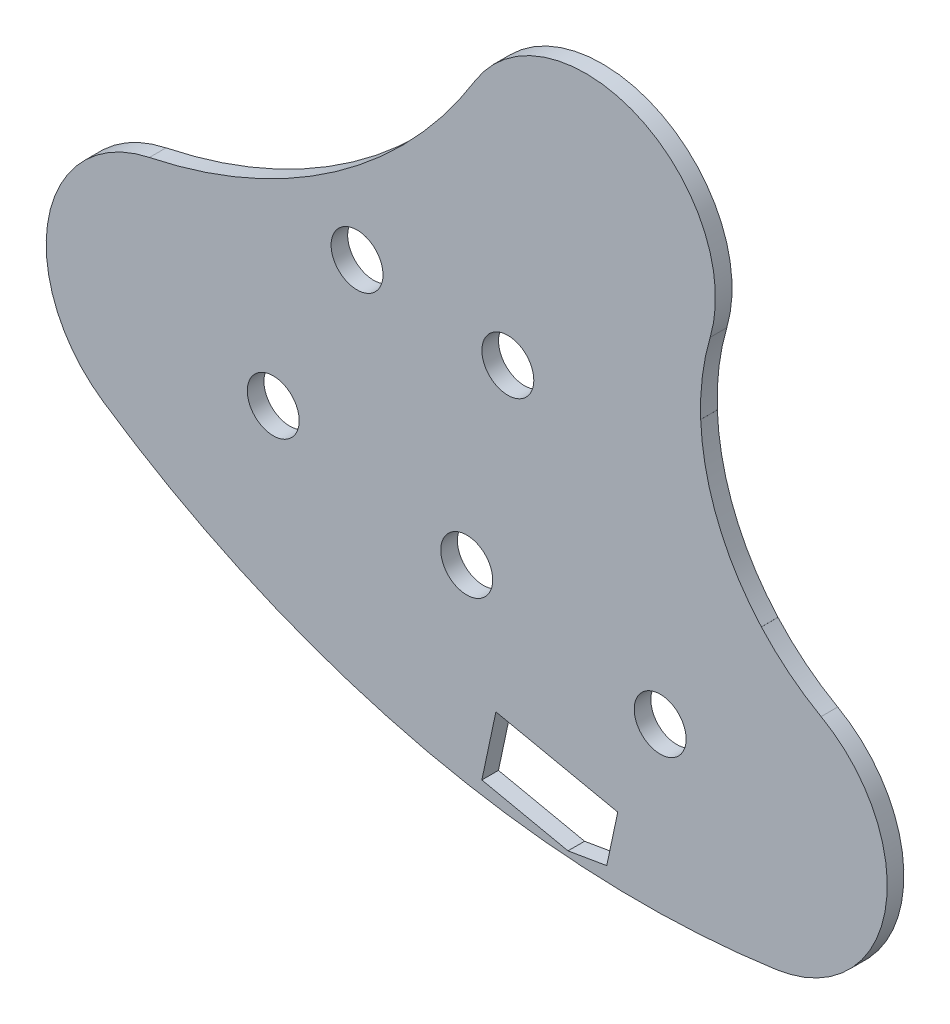
ISO-10303-21;
HEADER;
FILE_DESCRIPTION(('STEP AP214'),'2;1');
FILE_NAME('part.step','',(''),(''),'','','');
FILE_SCHEMA(('AUTOMOTIVE_DESIGN { 1 0 10303 214 1 1 1 1 }'));
ENDSEC;
DATA;
#1=APPLICATION_CONTEXT('core data for automotive mechanical design processes');
#2=APPLICATION_PROTOCOL_DEFINITION('international standard','automotive_design',2000,#1);
#3=PRODUCT_CONTEXT('',#1,'mechanical');
#4=PRODUCT('Part','Part','',(#3));
#5=PRODUCT_RELATED_PRODUCT_CATEGORY('part','',(#4));
#6=PRODUCT_DEFINITION_FORMATION('','',#4);
#7=PRODUCT_DEFINITION_CONTEXT('part definition',#1,'design');
#8=PRODUCT_DEFINITION('design','',#6,#7);
#9=PRODUCT_DEFINITION_SHAPE('','',#8);
#10=(LENGTH_UNIT() NAMED_UNIT(*) SI_UNIT(.MILLI.,.METRE.));
#11=(NAMED_UNIT(*) PLANE_ANGLE_UNIT() SI_UNIT($,.RADIAN.));
#12=(NAMED_UNIT(*) SI_UNIT($,.STERADIAN.) SOLID_ANGLE_UNIT());
#13=UNCERTAINTY_MEASURE_WITH_UNIT(LENGTH_MEASURE(1.E-05),#10,'distance_accuracy_value','');
#14=(GEOMETRIC_REPRESENTATION_CONTEXT(3) GLOBAL_UNCERTAINTY_ASSIGNED_CONTEXT((#13)) GLOBAL_UNIT_ASSIGNED_CONTEXT((#10,
#11,#12)) REPRESENTATION_CONTEXT('',''));
#15=CARTESIAN_POINT('',(0.,0.,0.));
#16=DIRECTION('',(0.,0.,1.));
#17=DIRECTION('',(1.,0.,0.));
#18=AXIS2_PLACEMENT_3D('',#15,#16,#17);
#19=CARTESIAN_POINT('',(0.,0.,0.));
#20=DIRECTION('',(0.,0.,1.));
#21=DIRECTION('',(1.,0.,0.));
#22=AXIS2_PLACEMENT_3D('',#19,#20,#21);
#23=PLANE('',#22);
#24=CARTESIAN_POINT('',(52.9965563220559,89.470524089229,0.));
#25=DIRECTION('',(0.,0.,1.));
#26=DIRECTION('',(1.,0.,0.));
#27=AXIS2_PLACEMENT_3D('',#24,#25,#26);
#28=CIRCLE('',#27,12.5);
#29=CARTESIAN_POINT('',(50.4360820238531,101.705472857746,0.));
#30=VERTEX_POINT('',#29);
#31=CARTESIAN_POINT('',(45.9842444447804,79.1226990938099,0.));
#32=VERTEX_POINT('',#31);
#33=EDGE_CURVE('E526',#30,#32,#28,.T.);
#34=ORIENTED_EDGE('',*,*,#33,.F.);
#35=CARTESIAN_POINT('',(40.5106952967139,149.132856994939,0.));
#36=DIRECTION('',(0.,0.,1.));
#37=DIRECTION('',(1.,0.,0.));
#38=AXIS2_PLACEMENT_3D('',#35,#36,#37);
#39=CIRCLE('',#38,48.4548250206325);
#40=CARTESIAN_POINT('',(81.8031102070491,123.77922730109,0.));
#41=VERTEX_POINT('',#40);
#42=EDGE_CURVE('E508',#30,#41,#39,.T.);
#43=ORIENTED_EDGE('',*,*,#42,.T.);
#44=CARTESIAN_POINT('',(92.4554071900515,117.238694525702,0.));
#45=DIRECTION('',(0.,0.,1.));
#46=DIRECTION('',(1.,0.,0.));
#47=AXIS2_PLACEMENT_3D('',#44,#45,#46);
#48=CIRCLE('',#47,12.5);
#49=CARTESIAN_POINT('',(104.446158592985,113.70713951508,0.));
#50=VERTEX_POINT('',#49);
#51=EDGE_CURVE('E693',#50,#41,#48,.T.);
#52=ORIENTED_EDGE('',*,*,#51,.F.);
#53=CARTESIAN_POINT('',(126.300081547321,107.270651215251,0.));
#54=DIRECTION('',(0.,0.,1.));
#55=DIRECTION('',(1.,0.,0.));
#56=AXIS2_PLACEMENT_3D('',#53,#54,#55);
#57=CIRCLE('',#56,22.7820615864298);
#58=CARTESIAN_POINT('',(103.534701401386,106.398987897814,0.));
#59=VERTEX_POINT('',#58);
#60=EDGE_CURVE('E573',#50,#59,#57,.T.);
#61=ORIENTED_EDGE('',*,*,#60,.T.);
#62=CARTESIAN_POINT('',(92.4554071900515,117.238694525702,0.));
#63=DIRECTION('',(0.,0.,1.));
#64=DIRECTION('',(1.,0.,0.));
#65=AXIS2_PLACEMENT_3D('',#62,#63,#64);
#66=CIRCLE('',#65,15.5);
#67=CARTESIAN_POINT('',(103.532400156425,106.396636288314,0.));
#68=VERTEX_POINT('',#67);
#69=EDGE_CURVE('E588',#68,#59,#66,.T.);
#70=ORIENTED_EDGE('',*,*,#69,.F.);
#71=CARTESIAN_POINT('',(82.4965563220559,89.470524089229,0.));
#72=DIRECTION('',(0.,0.,1.));
#73=DIRECTION('',(1.,0.,0.));
#74=AXIS2_PLACEMENT_3D('',#71,#72,#73);
#75=CIRCLE('',#74,27.);
#76=CARTESIAN_POINT('',(103.534911629456,106.393514544807,0.));
#77=VERTEX_POINT('',#76);
#78=EDGE_CURVE('E518',#77,#68,#75,.T.);
#79=ORIENTED_EDGE('',*,*,#78,.F.);
#80=CARTESIAN_POINT('',(126.300081547321,107.270651215251,0.));
#81=DIRECTION('',(0.,0.,1.));
#82=DIRECTION('',(1.,0.,0.));
#83=AXIS2_PLACEMENT_3D('',#80,#81,#82);
#84=CIRCLE('',#83,22.7820615864298);
#85=CARTESIAN_POINT('',(109.375963817062,92.0195342338546,0.));
#86=VERTEX_POINT('',#85);
#87=EDGE_CURVE('E549',#77,#86,#84,.T.);
#88=ORIENTED_EDGE('',*,*,#87,.T.);
#89=CARTESIAN_POINT('',(82.4965563220559,89.470524089229,0.));
#90=DIRECTION('',(0.,0.,1.));
#91=DIRECTION('',(1.,0.,0.));
#92=AXIS2_PLACEMENT_3D('',#89,#90,#91);
#93=CIRCLE('',#92,27.);
#94=CARTESIAN_POINT('',(109.376341774582,92.0155455088173,0.));
#95=VERTEX_POINT('',#94);
#96=EDGE_CURVE('E618',#95,#86,#93,.T.);
#97=ORIENTED_EDGE('',*,*,#96,.F.);
#98=CARTESIAN_POINT('',(109.001946023779,76.5200678517142,0.));
#99=DIRECTION('',(0.,0.,1.));
#100=DIRECTION('',(1.,0.,0.));
#101=AXIS2_PLACEMENT_3D('',#98,#99,#100);
#102=CIRCLE('',#101,15.5);
#103=CARTESIAN_POINT('',(109.37963106383,92.0154656849588,0.));
#104=VERTEX_POINT('',#103);
#105=EDGE_CURVE('E612',#104,#95,#102,.T.);
#106=ORIENTED_EDGE('',*,*,#105,.F.);
#107=CARTESIAN_POINT('',(126.300081547321,107.270651215251,0.));
#108=DIRECTION('',(0.,0.,1.));
#109=DIRECTION('',(1.,0.,0.));
#110=AXIS2_PLACEMENT_3D('',#107,#108,#109);
#111=CIRCLE('',#110,22.7820615864298);
#112=CARTESIAN_POINT('',(115.130462451726,87.4146209124131,0.));
#113=VERTEX_POINT('',#112);
#114=EDGE_CURVE('E607',#104,#113,#111,.T.);
#115=ORIENTED_EDGE('',*,*,#114,.T.);
#116=CARTESIAN_POINT('',(109.001946023779,76.5200678517142,0.));
#117=DIRECTION('',(0.,0.,1.));
#118=DIRECTION('',(1.,0.,0.));
#119=AXIS2_PLACEMENT_3D('',#116,#117,#118);
#120=CIRCLE('',#119,12.5);
#121=CARTESIAN_POINT('',(110.759742778375,64.144278964959,0.));
#122=VERTEX_POINT('',#121);
#123=EDGE_CURVE('E534',#122,#113,#120,.T.);
#124=ORIENTED_EDGE('',*,*,#123,.F.);
#125=CARTESIAN_POINT('',(97.7767609787734,155.551116218682,0.));
#126=DIRECTION('',(0.,0.,1.));
#127=DIRECTION('',(1.,0.,0.));
#128=AXIS2_PLACEMENT_3D('',#125,#126,#127);
#129=CIRCLE('',#128,92.3242531144305);
#130=CARTESIAN_POINT('',(77.410522601919,65.501218675628,0.));
#131=VERTEX_POINT('',#130);
#132=EDGE_CURVE('E639',#122,#131,#129,.F.);
#133=ORIENTED_EDGE('',*,*,#132,.T.);
#134=CARTESIAN_POINT('',(76.7672701031981,63.0853904071267,0.));
#135=DIRECTION('',(0.,0.,1.));
#136=DIRECTION('',(1.,0.,0.));
#137=AXIS2_PLACEMENT_3D('',#134,#135,#136);
#138=CIRCLE('',#137,2.50000000000012);
#139=CARTESIAN_POINT('',(77.2977595679072,65.5284583406548,0.));
#140=VERTEX_POINT('',#139);
#141=EDGE_CURVE('E644',#131,#140,#138,.T.);
#142=ORIENTED_EDGE('',*,*,#141,.T.);
#143=CARTESIAN_POINT('',(82.4965563220559,89.470524089229,0.));
#144=DIRECTION('',(0.,0.,1.));
#145=DIRECTION('',(1.,0.,0.));
#146=AXIS2_PLACEMENT_3D('',#143,#144,#145);
#147=CIRCLE('',#146,24.5);
#148=CARTESIAN_POINT('',(76.9769229033441,65.6003827632326,0.));
#149=VERTEX_POINT('',#148);
#150=EDGE_CURVE('E252',#149,#140,#147,.T.);
#151=ORIENTED_EDGE('',*,*,#150,.F.);
#152=CARTESIAN_POINT('',(97.7767609787734,155.551116218682,0.));
#153=DIRECTION('',(0.,0.,1.));
#154=DIRECTION('',(1.,0.,0.));
#155=AXIS2_PLACEMENT_3D('',#152,#153,#154);
#156=CIRCLE('',#155,92.3242531144305);
#157=EDGE_CURVE('E665',#149,#32,#156,.F.);
#158=ORIENTED_EDGE('',*,*,#157,.T.);
#159=EDGE_LOOP('',(#34,#43,#52,#61,#70,#79,#88,#97,#106,#115,#124,#133,#142,#151,#158));
#160=FACE_BOUND('',#159,.T.);
#161=CARTESIAN_POINT('',(70.4353096538402,103.157249982459,0.));
#162=DIRECTION('',(0.,0.,1.));
#163=DIRECTION('',(1.,0.,0.));
#164=AXIS2_PLACEMENT_3D('',#161,#162,#163);
#165=CIRCLE('',#164,2.50000000000001);
#166=CARTESIAN_POINT('',(72.9353096538402,103.157249982459,0.));
#167=VERTEX_POINT('',#166);
#168=EDGE_CURVE('E461',#167,#167,#165,.T.);
#169=ORIENTED_EDGE('',*,*,#168,.T.);
#170=EDGE_LOOP('',(#169));
#171=FACE_BOUND('',#170,.T.);
#172=CARTESIAN_POINT('',(84.9599688829958,101.629007764451,0.));
#173=DIRECTION('',(0.,0.,1.));
#174=DIRECTION('',(1.,0.,0.));
#175=AXIS2_PLACEMENT_3D('',#172,#173,#174);
#176=CIRCLE('',#175,2.50000000000001);
#177=CARTESIAN_POINT('',(87.4599688829958,101.629007764451,0.));
#178=VERTEX_POINT('',#177);
#179=EDGE_CURVE('E484',#178,#178,#176,.T.);
#180=ORIENTED_EDGE('',*,*,#179,.T.);
#181=EDGE_LOOP('',(#180));
#182=FACE_BOUND('',#181,.T.);
#183=CARTESIAN_POINT('',(99.6329629668965,79.0345782603933,0.));
#184=DIRECTION('',(0.,0.,1.));
#185=DIRECTION('',(1.,0.,0.));
#186=AXIS2_PLACEMENT_3D('',#183,#184,#185);
#187=CIRCLE('',#186,2.5);
#188=CARTESIAN_POINT('',(102.132962966897,79.0345782603933,0.));
#189=VERTEX_POINT('',#188);
#190=EDGE_CURVE('E476',#189,#189,#187,.T.);
#191=ORIENTED_EDGE('',*,*,#190,.T.);
#192=EDGE_LOOP('',(#191));
#193=FACE_BOUND('',#192,.T.);
#194=CARTESIAN_POINT('',(80.9992511729175,82.9952959704716,0.));
#195=DIRECTION('',(0.,0.,1.));
#196=DIRECTION('',(1.,0.,0.));
#197=AXIS2_PLACEMENT_3D('',#194,#195,#196);
#198=CIRCLE('',#197,2.5);
#199=CARTESIAN_POINT('',(83.4992511729175,82.9952959704716,0.));
#200=VERTEX_POINT('',#199);
#201=EDGE_CURVE('E475',#200,#200,#198,.T.);
#202=ORIENTED_EDGE('',*,*,#201,.T.);
#203=EDGE_LOOP('',(#202));
#204=FACE_BOUND('',#203,.T.);
#205=CARTESIAN_POINT('',(62.3655393789385,86.9560136805499,0.));
#206=DIRECTION('',(0.,0.,1.));
#207=DIRECTION('',(1.,0.,0.));
#208=AXIS2_PLACEMENT_3D('',#205,#206,#207);
#209=CIRCLE('',#208,2.5);
#210=CARTESIAN_POINT('',(64.8655393789385,86.9560136805499,0.));
#211=VERTEX_POINT('',#210);
#212=EDGE_CURVE('E462',#211,#211,#209,.T.);
#213=ORIENTED_EDGE('',*,*,#212,.T.);
#214=EDGE_LOOP('',(#213));
#215=FACE_BOUND('',#214,.T.);
#216=DIRECTION('',(0.978147600733806,-0.20791169081776,0.));
#217=VECTOR('',#216,1.);
#218=CARTESIAN_POINT('',(16.9442499420159,79.7164284597365,0.));
#219=LINE('',#218,#217);
#220=CARTESIAN_POINT('',(82.4566955428004,65.7913282762393,0.));
#221=VERTEX_POINT('',#220);
#222=CARTESIAN_POINT('',(90.7515686359166,64.0281985720774,0.));
#223=VERTEX_POINT('',#222);
#224=EDGE_CURVE('E266',#221,#223,#219,.T.);
#225=ORIENTED_EDGE('',*,*,#224,.T.);
#226=DIRECTION('',(0.985907654294996,0.167290457595582,0.));
#227=VECTOR('',#226,1.);
#228=CARTESIAN_POINT('',(-8.02057698091892,47.2683759193629,0.));
#229=LINE('',#228,#227);
#230=CARTESIAN_POINT('',(94.48465908928,64.6616355957867,0.));
#231=VERTEX_POINT('',#230);
#232=EDGE_CURVE('E403',#223,#231,#229,.T.);
#233=ORIENTED_EDGE('',*,*,#232,.T.);
#234=DIRECTION('',(-0.207911690817762,-0.978147600733805,0.));
#235=VECTOR('',#234,1.);
#236=CARTESIAN_POINT('',(77.2502168095899,-16.4200404733104,0.));
#237=LINE('',#236,#235);
#238=CARTESIAN_POINT('',(95.5458927419215,69.6543473911959,0.));
#239=VERTEX_POINT('',#238);
#240=EDGE_CURVE('E435',#239,#231,#237,.T.);
#241=ORIENTED_EDGE('',*,*,#240,.F.);
#242=DIRECTION('',(0.978147600733806,-0.20791169081776,0.));
#243=VECTOR('',#242,1.);
#244=CARTESIAN_POINT('',(18.2956759323314,86.0743878645062,0.));
#245=LINE('',#244,#243);
#246=CARTESIAN_POINT('',(83.8081215331159,72.1492876810091,0.));
#247=VERTEX_POINT('',#246);
#248=EDGE_CURVE('E439',#247,#239,#245,.T.);
#249=ORIENTED_EDGE('',*,*,#248,.F.);
#250=DIRECTION('',(-0.207911690817762,-0.978147600733805,0.));
#251=VECTOR('',#250,1.);
#252=CARTESIAN_POINT('',(65.5124456007842,-13.9251001834973,0.));
#253=LINE('',#252,#251);
#254=EDGE_CURVE('E397',#247,#221,#253,.T.);
#255=ORIENTED_EDGE('',*,*,#254,.T.);
#256=EDGE_LOOP('',(#225,#233,#241,#249,#255));
#257=FACE_BOUND('',#256,.T.);
#258=ADVANCED_FACE('F248',(#160,#171,#182,#193,#204,#215,#257),#23,.F.);
#259=CARTESIAN_POINT('',(0.,0.,1.6));
#260=DIRECTION('',(0.,0.,1.));
#261=DIRECTION('',(1.,0.,0.));
#262=AXIS2_PLACEMENT_3D('',#259,#260,#261);
#263=PLANE('',#262);
#264=CARTESIAN_POINT('',(62.3655393789385,86.9560136805499,1.6));
#265=DIRECTION('',(0.,0.,1.));
#266=DIRECTION('',(1.,0.,0.));
#267=AXIS2_PLACEMENT_3D('',#264,#265,#266);
#268=CIRCLE('',#267,2.5);
#269=CARTESIAN_POINT('',(64.8655393789385,86.9560136805499,1.6));
#270=VERTEX_POINT('',#269);
#271=EDGE_CURVE('E456',#270,#270,#268,.T.);
#272=ORIENTED_EDGE('',*,*,#271,.F.);
#273=EDGE_LOOP('',(#272));
#274=FACE_BOUND('',#273,.T.);
#275=CARTESIAN_POINT('',(80.9992511729175,82.9952959704716,1.6));
#276=DIRECTION('',(0.,0.,1.));
#277=DIRECTION('',(1.,0.,0.));
#278=AXIS2_PLACEMENT_3D('',#275,#276,#277);
#279=CIRCLE('',#278,2.5);
#280=CARTESIAN_POINT('',(83.4992511729175,82.9952959704716,1.6));
#281=VERTEX_POINT('',#280);
#282=EDGE_CURVE('E470',#281,#281,#279,.T.);
#283=ORIENTED_EDGE('',*,*,#282,.F.);
#284=EDGE_LOOP('',(#283));
#285=FACE_BOUND('',#284,.T.);
#286=CARTESIAN_POINT('',(99.6329629668965,79.0345782603933,1.6));
#287=DIRECTION('',(0.,0.,1.));
#288=DIRECTION('',(1.,0.,0.));
#289=AXIS2_PLACEMENT_3D('',#286,#287,#288);
#290=CIRCLE('',#289,2.5);
#291=CARTESIAN_POINT('',(102.132962966897,79.0345782603933,1.6));
#292=VERTEX_POINT('',#291);
#293=EDGE_CURVE('E479',#292,#292,#290,.T.);
#294=ORIENTED_EDGE('',*,*,#293,.F.);
#295=EDGE_LOOP('',(#294));
#296=FACE_BOUND('',#295,.T.);
#297=CARTESIAN_POINT('',(84.9599688829958,101.629007764451,1.6));
#298=DIRECTION('',(0.,0.,1.));
#299=DIRECTION('',(1.,0.,0.));
#300=AXIS2_PLACEMENT_3D('',#297,#298,#299);
#301=CIRCLE('',#300,2.50000000000001);
#302=CARTESIAN_POINT('',(87.4599688829958,101.629007764451,1.6));
#303=VERTEX_POINT('',#302);
#304=EDGE_CURVE('E405',#303,#303,#301,.T.);
#305=ORIENTED_EDGE('',*,*,#304,.F.);
#306=EDGE_LOOP('',(#305));
#307=FACE_BOUND('',#306,.T.);
#308=CARTESIAN_POINT('',(70.4353096538402,103.157249982459,1.6));
#309=DIRECTION('',(0.,0.,1.));
#310=DIRECTION('',(1.,0.,0.));
#311=AXIS2_PLACEMENT_3D('',#308,#309,#310);
#312=CIRCLE('',#311,2.50000000000001);
#313=CARTESIAN_POINT('',(72.9353096538402,103.157249982459,1.6));
#314=VERTEX_POINT('',#313);
#315=EDGE_CURVE('E492',#314,#314,#312,.T.);
#316=ORIENTED_EDGE('',*,*,#315,.F.);
#317=EDGE_LOOP('',(#316));
#318=FACE_BOUND('',#317,.T.);
#319=CARTESIAN_POINT('',(40.5106952967139,149.132856994939,1.6));
#320=DIRECTION('',(0.,0.,1.));
#321=DIRECTION('',(1.,0.,0.));
#322=AXIS2_PLACEMENT_3D('',#319,#320,#321);
#323=CIRCLE('',#322,48.4548250206325);
#324=CARTESIAN_POINT('',(50.4360820238531,101.705472857746,1.6));
#325=VERTEX_POINT('',#324);
#326=CARTESIAN_POINT('',(81.8031102070491,123.77922730109,1.6));
#327=VERTEX_POINT('',#326);
#328=EDGE_CURVE('E501',#325,#327,#323,.T.);
#329=ORIENTED_EDGE('',*,*,#328,.F.);
#330=CARTESIAN_POINT('',(52.9965563220559,89.470524089229,1.6));
#331=DIRECTION('',(0.,0.,1.));
#332=DIRECTION('',(1.,0.,0.));
#333=AXIS2_PLACEMENT_3D('',#330,#331,#332);
#334=CIRCLE('',#333,12.5);
#335=CARTESIAN_POINT('',(45.9842444447804,79.1226990938099,1.6));
#336=VERTEX_POINT('',#335);
#337=EDGE_CURVE('E521',#325,#336,#334,.T.);
#338=ORIENTED_EDGE('',*,*,#337,.T.);
#339=CARTESIAN_POINT('',(97.7767609787734,155.551116218682,1.6));
#340=DIRECTION('',(0.,0.,1.));
#341=DIRECTION('',(1.,0.,0.));
#342=AXIS2_PLACEMENT_3D('',#339,#340,#341);
#343=CIRCLE('',#342,92.3242531144305);
#344=CARTESIAN_POINT('',(76.9769229033441,65.6003827632326,1.6));
#345=VERTEX_POINT('',#344);
#346=EDGE_CURVE('E670',#345,#336,#343,.F.);
#347=ORIENTED_EDGE('',*,*,#346,.F.);
#348=CARTESIAN_POINT('',(82.4965563220559,89.470524089229,1.6));
#349=DIRECTION('',(0.,0.,1.));
#350=DIRECTION('',(1.,0.,0.));
#351=AXIS2_PLACEMENT_3D('',#348,#349,#350);
#352=CIRCLE('',#351,24.5);
#353=CARTESIAN_POINT('',(77.2977595679072,65.5284583406548,1.6));
#354=VERTEX_POINT('',#353);
#355=EDGE_CURVE('E690',#345,#354,#352,.T.);
#356=ORIENTED_EDGE('',*,*,#355,.T.);
#357=CARTESIAN_POINT('',(76.7672701031981,63.0853904071267,1.6));
#358=DIRECTION('',(0.,0.,1.));
#359=DIRECTION('',(1.,0.,0.));
#360=AXIS2_PLACEMENT_3D('',#357,#358,#359);
#361=CIRCLE('',#360,2.50000000000012);
#362=CARTESIAN_POINT('',(77.410522601919,65.501218675628,1.6));
#363=VERTEX_POINT('',#362);
#364=EDGE_CURVE('E652',#363,#354,#361,.T.);
#365=ORIENTED_EDGE('',*,*,#364,.F.);
#366=CARTESIAN_POINT('',(97.7767609787734,155.551116218682,1.6));
#367=DIRECTION('',(0.,0.,1.));
#368=DIRECTION('',(1.,0.,0.));
#369=AXIS2_PLACEMENT_3D('',#366,#367,#368);
#370=CIRCLE('',#369,92.3242531144305);
#371=CARTESIAN_POINT('',(110.759742778375,64.144278964959,1.6));
#372=VERTEX_POINT('',#371);
#373=EDGE_CURVE('E650',#372,#363,#370,.F.);
#374=ORIENTED_EDGE('',*,*,#373,.F.);
#375=CARTESIAN_POINT('',(109.001946023779,76.5200678517142,1.6));
#376=DIRECTION('',(0.,0.,1.));
#377=DIRECTION('',(1.,0.,0.));
#378=AXIS2_PLACEMENT_3D('',#375,#376,#377);
#379=CIRCLE('',#378,12.5);
#380=CARTESIAN_POINT('',(115.130462451726,87.4146209124131,1.6));
#381=VERTEX_POINT('',#380);
#382=EDGE_CURVE('E530',#372,#381,#379,.T.);
#383=ORIENTED_EDGE('',*,*,#382,.T.);
#384=CARTESIAN_POINT('',(126.300081547321,107.270651215251,1.6));
#385=DIRECTION('',(0.,0.,1.));
#386=DIRECTION('',(1.,0.,0.));
#387=AXIS2_PLACEMENT_3D('',#384,#385,#386);
#388=CIRCLE('',#387,22.7820615864298);
#389=CARTESIAN_POINT('',(109.37963106383,92.0154656849588,1.6));
#390=VERTEX_POINT('',#389);
#391=EDGE_CURVE('E543',#390,#381,#388,.T.);
#392=ORIENTED_EDGE('',*,*,#391,.F.);
#393=CARTESIAN_POINT('',(109.001946023779,76.5200678517142,1.6));
#394=DIRECTION('',(0.,0.,1.));
#395=DIRECTION('',(1.,0.,0.));
#396=AXIS2_PLACEMENT_3D('',#393,#394,#395);
#397=CIRCLE('',#396,15.5);
#398=CARTESIAN_POINT('',(109.376341774582,92.0155455088173,1.6));
#399=VERTEX_POINT('',#398);
#400=EDGE_CURVE('E548',#390,#399,#397,.T.);
#401=ORIENTED_EDGE('',*,*,#400,.T.);
#402=CARTESIAN_POINT('',(82.4965563220559,89.470524089229,1.6));
#403=DIRECTION('',(0.,0.,1.));
#404=DIRECTION('',(1.,0.,0.));
#405=AXIS2_PLACEMENT_3D('',#402,#403,#404);
#406=CIRCLE('',#405,27.);
#407=CARTESIAN_POINT('',(109.375963817062,92.0195342338546,1.6));
#408=VERTEX_POINT('',#407);
#409=EDGE_CURVE('E555',#399,#408,#406,.T.);
#410=ORIENTED_EDGE('',*,*,#409,.T.);
#411=CARTESIAN_POINT('',(126.300081547321,107.270651215251,1.6));
#412=DIRECTION('',(0.,0.,1.));
#413=DIRECTION('',(1.,0.,0.));
#414=AXIS2_PLACEMENT_3D('',#411,#412,#413);
#415=CIRCLE('',#414,22.7820615864298);
#416=CARTESIAN_POINT('',(103.534911629456,106.393514544807,1.6));
#417=VERTEX_POINT('',#416);
#418=EDGE_CURVE('E559',#417,#408,#415,.T.);
#419=ORIENTED_EDGE('',*,*,#418,.F.);
#420=CARTESIAN_POINT('',(82.4965563220559,89.470524089229,1.6));
#421=DIRECTION('',(0.,0.,1.));
#422=DIRECTION('',(1.,0.,0.));
#423=AXIS2_PLACEMENT_3D('',#420,#421,#422);
#424=CIRCLE('',#423,27.);
#425=CARTESIAN_POINT('',(103.532400156425,106.396636288314,1.6));
#426=VERTEX_POINT('',#425);
#427=EDGE_CURVE('E567',#417,#426,#424,.T.);
#428=ORIENTED_EDGE('',*,*,#427,.T.);
#429=CARTESIAN_POINT('',(92.4554071900515,117.238694525702,1.6));
#430=DIRECTION('',(0.,0.,1.));
#431=DIRECTION('',(1.,0.,0.));
#432=AXIS2_PLACEMENT_3D('',#429,#430,#431);
#433=CIRCLE('',#432,15.5);
#434=CARTESIAN_POINT('',(103.534701401386,106.398987897814,1.6));
#435=VERTEX_POINT('',#434);
#436=EDGE_CURVE('E572',#426,#435,#433,.T.);
#437=ORIENTED_EDGE('',*,*,#436,.T.);
#438=CARTESIAN_POINT('',(126.300081547321,107.270651215251,1.6));
#439=DIRECTION('',(0.,0.,1.));
#440=DIRECTION('',(1.,0.,0.));
#441=AXIS2_PLACEMENT_3D('',#438,#439,#440);
#442=CIRCLE('',#441,22.7820615864298);
#443=CARTESIAN_POINT('',(104.446158592985,113.70713951508,1.6));
#444=VERTEX_POINT('',#443);
#445=EDGE_CURVE('E579',#444,#435,#442,.T.);
#446=ORIENTED_EDGE('',*,*,#445,.F.);
#447=CARTESIAN_POINT('',(92.4554071900515,117.238694525702,1.6));
#448=DIRECTION('',(0.,0.,1.));
#449=DIRECTION('',(1.,0.,0.));
#450=AXIS2_PLACEMENT_3D('',#447,#448,#449);
#451=CIRCLE('',#450,12.5);
#452=EDGE_CURVE('E774',#444,#327,#451,.T.);
#453=ORIENTED_EDGE('',*,*,#452,.T.);
#454=EDGE_LOOP('',(#329,#338,#347,#356,#365,#374,#383,#392,#401,#410,#419,#428,#437,#446,#453));
#455=FACE_BOUND('',#454,.T.);
#456=DIRECTION('',(0.985907654294996,0.167290457595582,0.));
#457=VECTOR('',#456,1.);
#458=CARTESIAN_POINT('',(-8.02057698091892,47.2683759193629,1.6));
#459=LINE('',#458,#457);
#460=CARTESIAN_POINT('',(90.7515686359166,64.0281985720774,1.6));
#461=VERTEX_POINT('',#460);
#462=CARTESIAN_POINT('',(94.48465908928,64.6616355957867,1.6));
#463=VERTEX_POINT('',#462);
#464=EDGE_CURVE('E396',#461,#463,#459,.T.);
#465=ORIENTED_EDGE('',*,*,#464,.F.);
#466=DIRECTION('',(0.978147600733806,-0.20791169081776,0.));
#467=VECTOR('',#466,1.);
#468=CARTESIAN_POINT('',(16.9442499420159,79.7164284597365,1.6));
#469=LINE('',#468,#467);
#470=CARTESIAN_POINT('',(82.4566955428004,65.7913282762393,1.6));
#471=VERTEX_POINT('',#470);
#472=EDGE_CURVE('E387',#471,#461,#469,.T.);
#473=ORIENTED_EDGE('',*,*,#472,.F.);
#474=DIRECTION('',(-0.207911690817762,-0.978147600733805,0.));
#475=VECTOR('',#474,1.);
#476=CARTESIAN_POINT('',(65.5124456007842,-13.9251001834973,1.6));
#477=LINE('',#476,#475);
#478=CARTESIAN_POINT('',(83.8081215331159,72.1492876810091,1.6));
#479=VERTEX_POINT('',#478);
#480=EDGE_CURVE('E426',#479,#471,#477,.T.);
#481=ORIENTED_EDGE('',*,*,#480,.F.);
#482=DIRECTION('',(0.978147600733806,-0.20791169081776,0.));
#483=VECTOR('',#482,1.);
#484=CARTESIAN_POINT('',(18.2956759323314,86.0743878645062,1.6));
#485=LINE('',#484,#483);
#486=CARTESIAN_POINT('',(95.5458927419215,69.6543473911959,1.6));
#487=VERTEX_POINT('',#486);
#488=EDGE_CURVE('E274',#479,#487,#485,.T.);
#489=ORIENTED_EDGE('',*,*,#488,.T.);
#490=DIRECTION('',(-0.207911690817762,-0.978147600733805,0.));
#491=VECTOR('',#490,1.);
#492=CARTESIAN_POINT('',(77.2502168095899,-16.4200404733104,1.6));
#493=LINE('',#492,#491);
#494=EDGE_CURVE('E411',#487,#463,#493,.T.);
#495=ORIENTED_EDGE('',*,*,#494,.T.);
#496=EDGE_LOOP('',(#465,#473,#481,#489,#495));
#497=FACE_BOUND('',#496,.T.);
#498=ADVANCED_FACE('F409',(#274,#285,#296,#307,#318,#455,#497),#263,.T.);
#499=CARTESIAN_POINT('',(97.7767609787734,155.551116218682,1.6));
#500=DIRECTION('',(0.,0.,-1.));
#501=DIRECTION('',(-1.,0.,0.));
#502=AXIS2_PLACEMENT_3D('',#499,#500,#501);
#503=CYLINDRICAL_SURFACE('',#502,92.3242531144305);
#504=ORIENTED_EDGE('',*,*,#157,.F.);
#505=DIRECTION('',(0.,0.,-1.));
#506=VECTOR('',#505,1.);
#507=CARTESIAN_POINT('',(76.9769229033441,65.6003827632326,1.6));
#508=LINE('',#507,#506);
#509=EDGE_CURVE('E13',#345,#149,#508,.T.);
#510=ORIENTED_EDGE('',*,*,#509,.F.);
#511=ORIENTED_EDGE('',*,*,#346,.T.);
#512=DIRECTION('',(0.,0.,-1.));
#513=VECTOR('',#512,1.);
#514=CARTESIAN_POINT('',(45.9842444447804,79.1226990938099,1.6));
#515=LINE('',#514,#513);
#516=EDGE_CURVE('E258',#336,#32,#515,.T.);
#517=ORIENTED_EDGE('',*,*,#516,.T.);
#518=EDGE_LOOP('',(#504,#510,#511,#517));
#519=FACE_BOUND('',#518,.T.);
#520=ADVANCED_FACE('F723',(#519),#503,.T.);
#521=CARTESIAN_POINT('',(109.001946023779,76.5200678517142,1.6));
#522=DIRECTION('',(0.,0.,-1.));
#523=DIRECTION('',(-1.,0.,0.));
#524=AXIS2_PLACEMENT_3D('',#521,#522,#523);
#525=CYLINDRICAL_SURFACE('',#524,12.5);
#526=ORIENTED_EDGE('',*,*,#382,.F.);
#527=DIRECTION('',(0.,0.,-1.));
#528=VECTOR('',#527,1.);
#529=CARTESIAN_POINT('',(110.759742778375,64.144278964959,1.6));
#530=LINE('',#529,#528);
#531=EDGE_CURVE('E550',#372,#122,#530,.T.);
#532=ORIENTED_EDGE('',*,*,#531,.T.);
#533=ORIENTED_EDGE('',*,*,#123,.T.);
#534=DIRECTION('',(0.,0.,-1.));
#535=VECTOR('',#534,1.);
#536=CARTESIAN_POINT('',(115.130462451726,87.4146209124131,1.6));
#537=LINE('',#536,#535);
#538=EDGE_CURVE('E574',#381,#113,#537,.T.);
#539=ORIENTED_EDGE('',*,*,#538,.F.);
#540=EDGE_LOOP('',(#526,#532,#533,#539));
#541=FACE_BOUND('',#540,.T.);
#542=ADVANCED_FACE('F728',(#541),#525,.T.);
#543=CARTESIAN_POINT('',(92.4554071900515,117.238694525702,1.6));
#544=DIRECTION('',(0.,0.,-1.));
#545=DIRECTION('',(-1.,0.,0.));
#546=AXIS2_PLACEMENT_3D('',#543,#544,#545);
#547=CYLINDRICAL_SURFACE('',#546,12.5);
#548=ORIENTED_EDGE('',*,*,#452,.F.);
#549=DIRECTION('',(0.,0.,-1.));
#550=VECTOR('',#549,1.);
#551=CARTESIAN_POINT('',(104.446158592985,113.70713951508,1.6));
#552=LINE('',#551,#550);
#553=EDGE_CURVE('E598',#444,#50,#552,.T.);
#554=ORIENTED_EDGE('',*,*,#553,.T.);
#555=ORIENTED_EDGE('',*,*,#51,.T.);
#556=DIRECTION('',(0.,0.,-1.));
#557=VECTOR('',#556,1.);
#558=CARTESIAN_POINT('',(81.8031102070491,123.77922730109,1.6));
#559=LINE('',#558,#557);
#560=EDGE_CURVE('E507',#327,#41,#559,.T.);
#561=ORIENTED_EDGE('',*,*,#560,.F.);
#562=EDGE_LOOP('',(#548,#554,#555,#561));
#563=FACE_BOUND('',#562,.T.);
#564=ADVANCED_FACE('F737',(#563),#547,.T.);
#565=CARTESIAN_POINT('',(97.7767609787734,155.551116218682,1.6));
#566=DIRECTION('',(0.,0.,-1.));
#567=DIRECTION('',(-1.,0.,0.));
#568=AXIS2_PLACEMENT_3D('',#565,#566,#567);
#569=CYLINDRICAL_SURFACE('',#568,92.3242531144305);
#570=ORIENTED_EDGE('',*,*,#132,.F.);
#571=ORIENTED_EDGE('',*,*,#531,.F.);
#572=ORIENTED_EDGE('',*,*,#373,.T.);
#573=DIRECTION('',(0.,0.,-1.));
#574=VECTOR('',#573,1.);
#575=CARTESIAN_POINT('',(77.410522601919,65.501218675628,1.6));
#576=LINE('',#575,#574);
#577=EDGE_CURVE('E656',#363,#131,#576,.T.);
#578=ORIENTED_EDGE('',*,*,#577,.T.);
#579=EDGE_LOOP('',(#570,#571,#572,#578));
#580=FACE_BOUND('',#579,.T.);
#581=ADVANCED_FACE('F733',(#580),#569,.T.);
#582=CARTESIAN_POINT('',(126.300081547321,107.270651215251,1.6));
#583=DIRECTION('',(0.,0.,-1.));
#584=DIRECTION('',(-1.,0.,0.));
#585=AXIS2_PLACEMENT_3D('',#582,#583,#584);
#586=CYLINDRICAL_SURFACE('',#585,22.7820615864298);
#587=ORIENTED_EDGE('',*,*,#114,.F.);
#588=DIRECTION('',(0.,0.,-1.));
#589=VECTOR('',#588,1.);
#590=CARTESIAN_POINT('',(109.37963106383,92.0154656849588,1.6));
#591=LINE('',#590,#589);
#592=EDGE_CURVE('E633',#390,#104,#591,.T.);
#593=ORIENTED_EDGE('',*,*,#592,.F.);
#594=ORIENTED_EDGE('',*,*,#391,.T.);
#595=ORIENTED_EDGE('',*,*,#538,.T.);
#596=EDGE_LOOP('',(#587,#593,#594,#595));
#597=FACE_BOUND('',#596,.T.);
#598=ADVANCED_FACE('F736',(#597),#586,.F.);
#599=CARTESIAN_POINT('',(109.001946023779,76.5200678517142,1.6));
#600=DIRECTION('',(0.,0.,-1.));
#601=DIRECTION('',(-1.,0.,0.));
#602=AXIS2_PLACEMENT_3D('',#599,#600,#601);
#603=CYLINDRICAL_SURFACE('',#602,15.5);
#604=ORIENTED_EDGE('',*,*,#105,.T.);
#605=DIRECTION('',(0.,0.,-1.));
#606=VECTOR('',#605,1.);
#607=CARTESIAN_POINT('',(109.376341774582,92.0155455088173,1.6));
#608=LINE('',#607,#606);
#609=EDGE_CURVE('E630',#399,#95,#608,.T.);
#610=ORIENTED_EDGE('',*,*,#609,.F.);
#611=ORIENTED_EDGE('',*,*,#400,.F.);
#612=ORIENTED_EDGE('',*,*,#592,.T.);
#613=EDGE_LOOP('',(#604,#610,#611,#612));
#614=FACE_BOUND('',#613,.T.);
#615=ADVANCED_FACE('F742',(#614),#603,.T.);
#616=CARTESIAN_POINT('',(82.4965563220559,89.470524089229,1.6));
#617=DIRECTION('',(0.,0.,-1.));
#618=DIRECTION('',(-1.,0.,0.));
#619=AXIS2_PLACEMENT_3D('',#616,#617,#618);
#620=CYLINDRICAL_SURFACE('',#619,27.);
#621=ORIENTED_EDGE('',*,*,#96,.T.);
#622=DIRECTION('',(0.,0.,-1.));
#623=VECTOR('',#622,1.);
#624=CARTESIAN_POINT('',(109.375963817062,92.0195342338546,1.6));
#625=LINE('',#624,#623);
#626=EDGE_CURVE('E627',#408,#86,#625,.T.);
#627=ORIENTED_EDGE('',*,*,#626,.F.);
#628=ORIENTED_EDGE('',*,*,#409,.F.);
#629=ORIENTED_EDGE('',*,*,#609,.T.);
#630=EDGE_LOOP('',(#621,#627,#628,#629));
#631=FACE_BOUND('',#630,.T.);
#632=ADVANCED_FACE('F738',(#631),#620,.T.);
#633=CARTESIAN_POINT('',(92.4554071900515,117.238694525702,1.6));
#634=DIRECTION('',(0.,0.,-1.));
#635=DIRECTION('',(-1.,0.,0.));
#636=AXIS2_PLACEMENT_3D('',#633,#634,#635);
#637=CYLINDRICAL_SURFACE('',#636,15.5);
#638=ORIENTED_EDGE('',*,*,#69,.T.);
#639=DIRECTION('',(0.,0.,-1.));
#640=VECTOR('',#639,1.);
#641=CARTESIAN_POINT('',(103.534701401386,106.398987897814,1.6));
#642=LINE('',#641,#640);
#643=EDGE_CURVE('E600',#435,#59,#642,.T.);
#644=ORIENTED_EDGE('',*,*,#643,.F.);
#645=ORIENTED_EDGE('',*,*,#436,.F.);
#646=DIRECTION('',(0.,0.,-1.));
#647=VECTOR('',#646,1.);
#648=CARTESIAN_POINT('',(103.532400156425,106.396636288314,1.6));
#649=LINE('',#648,#647);
#650=EDGE_CURVE('E509',#426,#68,#649,.T.);
#651=ORIENTED_EDGE('',*,*,#650,.T.);
#652=EDGE_LOOP('',(#638,#644,#645,#651));
#653=FACE_BOUND('',#652,.T.);
#654=ADVANCED_FACE('F741',(#653),#637,.T.);
#655=CARTESIAN_POINT('',(126.300081547321,107.270651215251,1.6));
#656=DIRECTION('',(0.,0.,-1.));
#657=DIRECTION('',(-1.,0.,0.));
#658=AXIS2_PLACEMENT_3D('',#655,#656,#657);
#659=CYLINDRICAL_SURFACE('',#658,22.7820615864298);
#660=ORIENTED_EDGE('',*,*,#60,.F.);
#661=ORIENTED_EDGE('',*,*,#553,.F.);
#662=ORIENTED_EDGE('',*,*,#445,.T.);
#663=ORIENTED_EDGE('',*,*,#643,.T.);
#664=EDGE_LOOP('',(#660,#661,#662,#663));
#665=FACE_BOUND('',#664,.T.);
#666=ADVANCED_FACE('F752',(#665),#659,.F.);
#667=CARTESIAN_POINT('',(126.300081547321,107.270651215251,1.6));
#668=DIRECTION('',(0.,0.,-1.));
#669=DIRECTION('',(-1.,0.,0.));
#670=AXIS2_PLACEMENT_3D('',#667,#668,#669);
#671=CYLINDRICAL_SURFACE('',#670,22.7820615864298);
#672=ORIENTED_EDGE('',*,*,#87,.F.);
#673=DIRECTION('',(0.,0.,-1.));
#674=VECTOR('',#673,1.);
#675=CARTESIAN_POINT('',(103.534911629456,106.393514544807,1.6));
#676=LINE('',#675,#674);
#677=EDGE_CURVE('E584',#417,#77,#676,.T.);
#678=ORIENTED_EDGE('',*,*,#677,.F.);
#679=ORIENTED_EDGE('',*,*,#418,.T.);
#680=ORIENTED_EDGE('',*,*,#626,.T.);
#681=EDGE_LOOP('',(#672,#678,#679,#680));
#682=FACE_BOUND('',#681,.T.);
#683=ADVANCED_FACE('F748',(#682),#671,.F.);
#684=CARTESIAN_POINT('',(82.4965563220559,89.470524089229,1.6));
#685=DIRECTION('',(0.,0.,-1.));
#686=DIRECTION('',(-1.,0.,0.));
#687=AXIS2_PLACEMENT_3D('',#684,#685,#686);
#688=CYLINDRICAL_SURFACE('',#687,27.);
#689=ORIENTED_EDGE('',*,*,#78,.T.);
#690=ORIENTED_EDGE('',*,*,#650,.F.);
#691=ORIENTED_EDGE('',*,*,#427,.F.);
#692=ORIENTED_EDGE('',*,*,#677,.T.);
#693=EDGE_LOOP('',(#689,#690,#691,#692));
#694=FACE_BOUND('',#693,.T.);
#695=ADVANCED_FACE('F751',(#694),#688,.T.);
#696=CARTESIAN_POINT('',(40.5106952967139,149.132856994939,1.6));
#697=DIRECTION('',(0.,0.,-1.));
#698=DIRECTION('',(-1.,0.,0.));
#699=AXIS2_PLACEMENT_3D('',#696,#697,#698);
#700=CYLINDRICAL_SURFACE('',#699,48.4548250206325);
#701=ORIENTED_EDGE('',*,*,#42,.F.);
#702=DIRECTION('',(0.,0.,-1.));
#703=VECTOR('',#702,1.);
#704=CARTESIAN_POINT('',(50.4360820238531,101.705472857746,1.6));
#705=LINE('',#704,#703);
#706=EDGE_CURVE('E514',#325,#30,#705,.T.);
#707=ORIENTED_EDGE('',*,*,#706,.F.);
#708=ORIENTED_EDGE('',*,*,#328,.T.);
#709=ORIENTED_EDGE('',*,*,#560,.T.);
#710=EDGE_LOOP('',(#701,#707,#708,#709));
#711=FACE_BOUND('',#710,.T.);
#712=ADVANCED_FACE('F732',(#711),#700,.F.);
#713=CARTESIAN_POINT('',(76.7672701031981,63.0853904071267,1.6));
#714=DIRECTION('',(0.,0.,-1.));
#715=DIRECTION('',(-1.,0.,0.));
#716=AXIS2_PLACEMENT_3D('',#713,#714,#715);
#717=CYLINDRICAL_SURFACE('',#716,2.50000000000012);
#718=ORIENTED_EDGE('',*,*,#141,.F.);
#719=ORIENTED_EDGE('',*,*,#577,.F.);
#720=ORIENTED_EDGE('',*,*,#364,.T.);
#721=DIRECTION('',(0.,0.,-1.));
#722=VECTOR('',#721,1.);
#723=CARTESIAN_POINT('',(77.2977595679072,65.5284583406548,1.6));
#724=LINE('',#723,#722);
#725=EDGE_CURVE('E658',#354,#140,#724,.T.);
#726=ORIENTED_EDGE('',*,*,#725,.T.);
#727=EDGE_LOOP('',(#718,#719,#720,#726));
#728=FACE_BOUND('',#727,.T.);
#729=ADVANCED_FACE('F686',(#728),#717,.F.);
#730=CARTESIAN_POINT('',(52.9965563220559,89.470524089229,1.6));
#731=DIRECTION('',(0.,0.,-1.));
#732=DIRECTION('',(-1.,0.,0.));
#733=AXIS2_PLACEMENT_3D('',#730,#731,#732);
#734=CYLINDRICAL_SURFACE('',#733,12.5);
#735=ORIENTED_EDGE('',*,*,#516,.F.);
#736=ORIENTED_EDGE('',*,*,#337,.F.);
#737=ORIENTED_EDGE('',*,*,#706,.T.);
#738=ORIENTED_EDGE('',*,*,#33,.T.);
#739=EDGE_LOOP('',(#735,#736,#737,#738));
#740=FACE_BOUND('',#739,.T.);
#741=ADVANCED_FACE('F716',(#740),#734,.T.);
#742=CARTESIAN_POINT('',(82.4965563220559,89.470524089229,1.6));
#743=DIRECTION('',(0.,0.,-1.));
#744=DIRECTION('',(-1.,0.,0.));
#745=AXIS2_PLACEMENT_3D('',#742,#743,#744);
#746=CYLINDRICAL_SURFACE('',#745,24.5);
#747=ORIENTED_EDGE('',*,*,#355,.F.);
#748=ORIENTED_EDGE('',*,*,#509,.T.);
#749=ORIENTED_EDGE('',*,*,#150,.T.);
#750=ORIENTED_EDGE('',*,*,#725,.F.);
#751=EDGE_LOOP('',(#747,#748,#749,#750));
#752=FACE_BOUND('',#751,.T.);
#753=ADVANCED_FACE('F250',(#752),#746,.T.);
#754=CARTESIAN_POINT('',(70.4353096538402,103.157249982459,1.6));
#755=DIRECTION('',(0.,0.,-1.));
#756=DIRECTION('',(-1.,0.,0.));
#757=AXIS2_PLACEMENT_3D('',#754,#755,#756);
#758=CYLINDRICAL_SURFACE('',#757,2.50000000000001);
#759=ORIENTED_EDGE('',*,*,#315,.T.);
#760=EDGE_LOOP('',(#759));
#761=FACE_BOUND('',#760,.T.);
#762=ORIENTED_EDGE('',*,*,#168,.F.);
#763=EDGE_LOOP('',(#762));
#764=FACE_BOUND('',#763,.T.);
#765=ADVANCED_FACE('F705',(#761,#764),#758,.F.);
#766=CARTESIAN_POINT('',(84.9599688829958,101.629007764451,1.6));
#767=DIRECTION('',(0.,0.,-1.));
#768=DIRECTION('',(-1.,0.,0.));
#769=AXIS2_PLACEMENT_3D('',#766,#767,#768);
#770=CYLINDRICAL_SURFACE('',#769,2.50000000000001);
#771=ORIENTED_EDGE('',*,*,#304,.T.);
#772=EDGE_LOOP('',(#771));
#773=FACE_BOUND('',#772,.T.);
#774=ORIENTED_EDGE('',*,*,#179,.F.);
#775=EDGE_LOOP('',(#774));
#776=FACE_BOUND('',#775,.T.);
#777=ADVANCED_FACE('F707',(#773,#776),#770,.F.);
#778=CARTESIAN_POINT('',(99.6329629668965,79.0345782603933,1.6));
#779=DIRECTION('',(0.,0.,-1.));
#780=DIRECTION('',(-1.,0.,0.));
#781=AXIS2_PLACEMENT_3D('',#778,#779,#780);
#782=CYLINDRICAL_SURFACE('',#781,2.5);
#783=ORIENTED_EDGE('',*,*,#293,.T.);
#784=EDGE_LOOP('',(#783));
#785=FACE_BOUND('',#784,.T.);
#786=ORIENTED_EDGE('',*,*,#190,.F.);
#787=EDGE_LOOP('',(#786));
#788=FACE_BOUND('',#787,.T.);
#789=ADVANCED_FACE('F713',(#785,#788),#782,.F.);
#790=CARTESIAN_POINT('',(80.9992511729175,82.9952959704716,1.6));
#791=DIRECTION('',(0.,0.,-1.));
#792=DIRECTION('',(-1.,0.,0.));
#793=AXIS2_PLACEMENT_3D('',#790,#791,#792);
#794=CYLINDRICAL_SURFACE('',#793,2.5);
#795=ORIENTED_EDGE('',*,*,#282,.T.);
#796=EDGE_LOOP('',(#795));
#797=FACE_BOUND('',#796,.T.);
#798=ORIENTED_EDGE('',*,*,#201,.F.);
#799=EDGE_LOOP('',(#798));
#800=FACE_BOUND('',#799,.T.);
#801=ADVANCED_FACE('F864',(#797,#800),#794,.F.);
#802=CARTESIAN_POINT('',(62.3655393789385,86.9560136805499,1.6));
#803=DIRECTION('',(0.,0.,-1.));
#804=DIRECTION('',(-1.,0.,0.));
#805=AXIS2_PLACEMENT_3D('',#802,#803,#804);
#806=CYLINDRICAL_SURFACE('',#805,2.5);
#807=ORIENTED_EDGE('',*,*,#271,.T.);
#808=EDGE_LOOP('',(#807));
#809=FACE_BOUND('',#808,.T.);
#810=ORIENTED_EDGE('',*,*,#212,.F.);
#811=EDGE_LOOP('',(#810));
#812=FACE_BOUND('',#811,.T.);
#813=ADVANCED_FACE('F874',(#809,#812),#806,.F.);
#814=CARTESIAN_POINT('',(16.9442499420159,79.7164284597365,1.6));
#815=DIRECTION('',(0.20791169081776,0.978147600733806,0.));
#816=DIRECTION('',(-0.978147600733806,0.20791169081776,0.));
#817=AXIS2_PLACEMENT_3D('',#814,#815,#816);
#818=PLANE('',#817);
#819=ORIENTED_EDGE('',*,*,#224,.F.);
#820=DIRECTION('',(0.,0.,-1.));
#821=VECTOR('',#820,1.);
#822=CARTESIAN_POINT('',(82.4566955428004,65.7913282762393,1.6));
#823=LINE('',#822,#821);
#824=EDGE_CURVE('E391',#471,#221,#823,.T.);
#825=ORIENTED_EDGE('',*,*,#824,.F.);
#826=ORIENTED_EDGE('',*,*,#472,.T.);
#827=DIRECTION('',(0.,0.,-1.));
#828=VECTOR('',#827,1.);
#829=CARTESIAN_POINT('',(90.7515686359166,64.0281985720774,1.6));
#830=LINE('',#829,#828);
#831=EDGE_CURVE('E390',#461,#223,#830,.T.);
#832=ORIENTED_EDGE('',*,*,#831,.T.);
#833=EDGE_LOOP('',(#819,#825,#826,#832));
#834=FACE_BOUND('',#833,.T.);
#835=ADVANCED_FACE('F389',(#834),#818,.T.);
#836=CARTESIAN_POINT('',(-8.02057698091892,47.2683759193629,1.6));
#837=DIRECTION('',(-0.167290457595582,0.985907654294996,0.));
#838=DIRECTION('',(-0.985907654294996,-0.167290457595582,0.));
#839=AXIS2_PLACEMENT_3D('',#836,#837,#838);
#840=PLANE('',#839);
#841=ORIENTED_EDGE('',*,*,#232,.F.);
#842=ORIENTED_EDGE('',*,*,#831,.F.);
#843=ORIENTED_EDGE('',*,*,#464,.T.);
#844=DIRECTION('',(0.,0.,-1.));
#845=VECTOR('',#844,1.);
#846=CARTESIAN_POINT('',(94.48465908928,64.6616355957867,1.6));
#847=LINE('',#846,#845);
#848=EDGE_CURVE('E406',#463,#231,#847,.T.);
#849=ORIENTED_EDGE('',*,*,#848,.T.);
#850=EDGE_LOOP('',(#841,#842,#843,#849));
#851=FACE_BOUND('',#850,.T.);
#852=ADVANCED_FACE('F400',(#851),#840,.T.);
#853=CARTESIAN_POINT('',(77.2502168095899,-16.4200404733104,1.6));
#854=DIRECTION('',(0.978147600733805,-0.207911690817762,0.));
#855=DIRECTION('',(0.207911690817762,0.978147600733805,0.));
#856=AXIS2_PLACEMENT_3D('',#853,#854,#855);
#857=PLANE('',#856);
#858=ORIENTED_EDGE('',*,*,#240,.T.);
#859=ORIENTED_EDGE('',*,*,#848,.F.);
#860=ORIENTED_EDGE('',*,*,#494,.F.);
#861=DIRECTION('',(0.,0.,-1.));
#862=VECTOR('',#861,1.);
#863=CARTESIAN_POINT('',(95.5458927419215,69.6543473911959,1.6));
#864=LINE('',#863,#862);
#865=EDGE_CURVE('E451',#487,#239,#864,.T.);
#866=ORIENTED_EDGE('',*,*,#865,.T.);
#867=EDGE_LOOP('',(#858,#859,#860,#866));
#868=FACE_BOUND('',#867,.T.);
#869=ADVANCED_FACE('F915',(#868),#857,.F.);
#870=CARTESIAN_POINT('',(18.2956759323314,86.0743878645062,1.6));
#871=DIRECTION('',(0.20791169081776,0.978147600733806,0.));
#872=DIRECTION('',(-0.978147600733806,0.20791169081776,0.));
#873=AXIS2_PLACEMENT_3D('',#870,#871,#872);
#874=PLANE('',#873);
#875=ORIENTED_EDGE('',*,*,#248,.T.);
#876=ORIENTED_EDGE('',*,*,#865,.F.);
#877=ORIENTED_EDGE('',*,*,#488,.F.);
#878=DIRECTION('',(0.,0.,-1.));
#879=VECTOR('',#878,1.);
#880=CARTESIAN_POINT('',(83.8081215331159,72.1492876810091,1.6));
#881=LINE('',#880,#879);
#882=EDGE_CURVE('E448',#479,#247,#881,.T.);
#883=ORIENTED_EDGE('',*,*,#882,.T.);
#884=EDGE_LOOP('',(#875,#876,#877,#883));
#885=FACE_BOUND('',#884,.T.);
#886=ADVANCED_FACE('F924',(#885),#874,.F.);
#887=CARTESIAN_POINT('',(65.5124456007842,-13.9251001834973,1.6));
#888=DIRECTION('',(0.978147600733805,-0.207911690817762,0.));
#889=DIRECTION('',(0.207911690817762,0.978147600733805,0.));
#890=AXIS2_PLACEMENT_3D('',#887,#888,#889);
#891=PLANE('',#890);
#892=ORIENTED_EDGE('',*,*,#254,.F.);
#893=ORIENTED_EDGE('',*,*,#882,.F.);
#894=ORIENTED_EDGE('',*,*,#480,.T.);
#895=ORIENTED_EDGE('',*,*,#824,.T.);
#896=EDGE_LOOP('',(#892,#893,#894,#895));
#897=FACE_BOUND('',#896,.T.);
#898=ADVANCED_FACE('F934',(#897),#891,.T.);
#899=CLOSED_SHELL('',(#258,#498,#520,#542,#564,#581,#598,#615,#632,#654,#666,#683,#695,#712,
#729,#741,#753,#765,#777,#789,#801,#813,#835,#852,#869,#886,#898));
#900=MANIFOLD_SOLID_BREP('B2',#899);
#901=ADVANCED_BREP_SHAPE_REPRESENTATION('',(#18,#900),#14);
#902=SHAPE_DEFINITION_REPRESENTATION(#9,#901);
ENDSEC;
END-ISO-10303-21;
